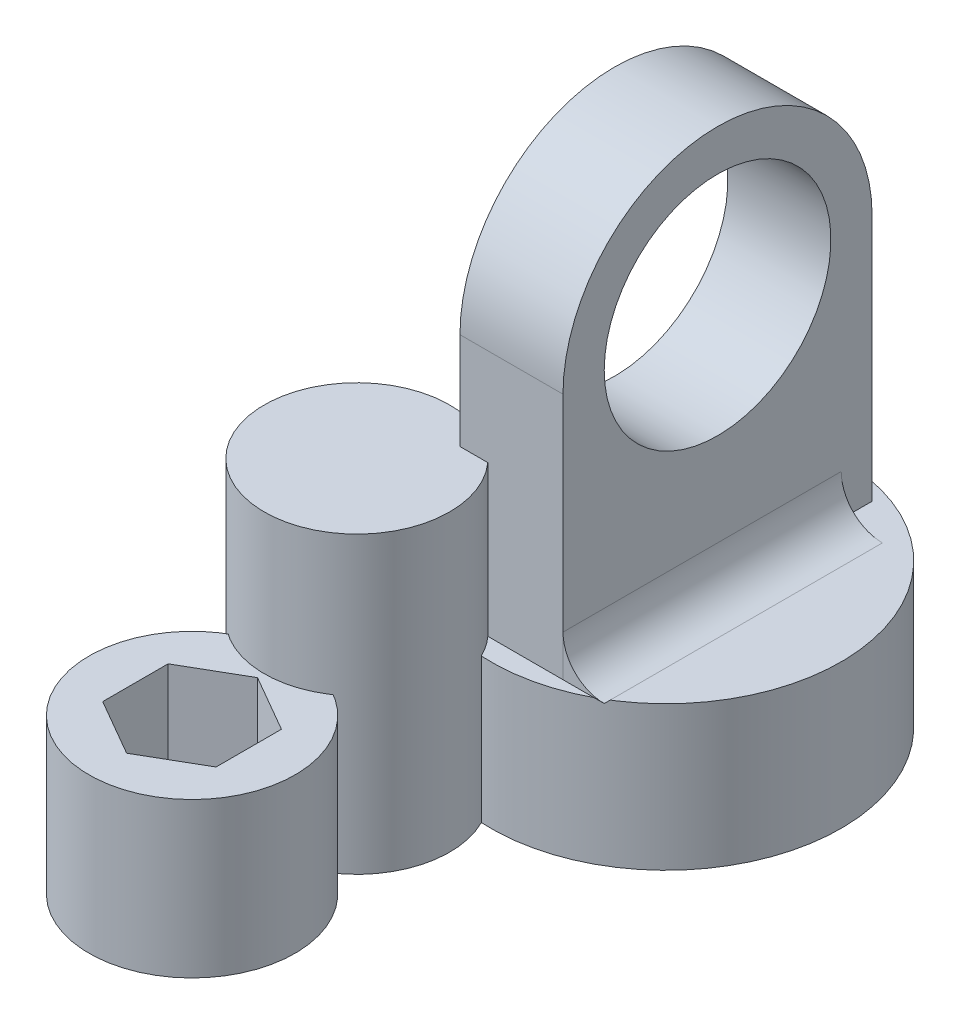
ISO-10303-21;
HEADER;
FILE_DESCRIPTION(('STEP AP214'),'2;1');
FILE_NAME('part.step','',(''),(''),'','','');
FILE_SCHEMA(('AUTOMOTIVE_DESIGN { 1 0 10303 214 1 1 1 1 }'));
ENDSEC;
DATA;
#1=APPLICATION_CONTEXT('core data for automotive mechanical design processes');
#2=APPLICATION_PROTOCOL_DEFINITION('international standard','automotive_design',2000,#1);
#3=PRODUCT_CONTEXT('',#1,'mechanical');
#4=PRODUCT('Part','Part','',(#3));
#5=PRODUCT_RELATED_PRODUCT_CATEGORY('part','',(#4));
#6=PRODUCT_DEFINITION_FORMATION('','',#4);
#7=PRODUCT_DEFINITION_CONTEXT('part definition',#1,'design');
#8=PRODUCT_DEFINITION('design','',#6,#7);
#9=PRODUCT_DEFINITION_SHAPE('','',#8);
#10=(LENGTH_UNIT() NAMED_UNIT(*) SI_UNIT(.MILLI.,.METRE.));
#11=(NAMED_UNIT(*) PLANE_ANGLE_UNIT() SI_UNIT($,.RADIAN.));
#12=(NAMED_UNIT(*) SI_UNIT($,.STERADIAN.) SOLID_ANGLE_UNIT());
#13=UNCERTAINTY_MEASURE_WITH_UNIT(LENGTH_MEASURE(1.E-05),#10,'distance_accuracy_value','');
#14=(GEOMETRIC_REPRESENTATION_CONTEXT(3) GLOBAL_UNCERTAINTY_ASSIGNED_CONTEXT((#13)) GLOBAL_UNIT_ASSIGNED_CONTEXT((#10,
#11,#12)) REPRESENTATION_CONTEXT('',''));
#15=CARTESIAN_POINT('',(0.,0.,0.));
#16=DIRECTION('',(0.,0.,1.));
#17=DIRECTION('',(1.,0.,0.));
#18=AXIS2_PLACEMENT_3D('',#15,#16,#17);
#19=CARTESIAN_POINT('',(-4.4999999999995,7.5,18.5));
#20=DIRECTION('',(0.,-1.,0.));
#21=DIRECTION('',(0.,0.,-1.));
#22=AXIS2_PLACEMENT_3D('',#19,#20,#21);
#23=CYLINDRICAL_SURFACE('',#22,4.99999999999976);
#24=CARTESIAN_POINT('',(-4.4999999999995,7.5,18.5));
#25=DIRECTION('',(0.,-1.,0.));
#26=DIRECTION('',(0.,0.,-1.));
#27=AXIS2_PLACEMENT_3D('',#24,#25,#26);
#28=CIRCLE('',#27,4.99999999999976);
#29=CARTESIAN_POINT('',(-4.4999999999995,7.5,13.5000000000002));
#30=VERTEX_POINT('',#29);
#31=EDGE_CURVE('E12',#30,#30,#28,.T.);
#32=ORIENTED_EDGE('',*,*,#31,.T.);
#33=EDGE_LOOP('',(#32));
#34=FACE_BOUND('',#33,.T.);
#35=CARTESIAN_POINT('',(-4.4999999999995,0.,18.5));
#36=DIRECTION('',(0.,-1.,0.));
#37=DIRECTION('',(0.,0.,-1.));
#38=AXIS2_PLACEMENT_3D('',#35,#36,#37);
#39=CIRCLE('',#38,4.99999999999976);
#40=CARTESIAN_POINT('',(-4.4999999999995,0.,13.5000000000002));
#41=VERTEX_POINT('',#40);
#42=EDGE_CURVE('E49',#41,#41,#39,.T.);
#43=ORIENTED_EDGE('',*,*,#42,.F.);
#44=EDGE_LOOP('',(#43));
#45=FACE_BOUND('',#44,.T.);
#46=ADVANCED_FACE('F46',(#34,#45),#23,.T.);
#47=CARTESIAN_POINT('',(-4.4999999999995,7.5,18.5));
#48=DIRECTION('',(0.,-1.,0.));
#49=DIRECTION('',(0.,0.,-1.));
#50=AXIS2_PLACEMENT_3D('',#47,#48,#49);
#51=PLANE('',#50);
#52=DIRECTION('',(-0.866025403784439,0.,-0.5));
#53=VECTOR('',#52,1.);
#54=CARTESIAN_POINT('',(-4.4999999999995,7.5,21.6754264805429));
#55=LINE('',#54,#53);
#56=CARTESIAN_POINT('',(-4.4999999999995,7.5,21.6754264805429));
#57=VERTEX_POINT('',#56);
#58=CARTESIAN_POINT('',(-7.24999999999949,7.5,20.0877132402714));
#59=VERTEX_POINT('',#58);
#60=EDGE_CURVE('E106',#57,#59,#55,.T.);
#61=ORIENTED_EDGE('',*,*,#60,.T.);
#62=DIRECTION('',(0.,0.,-1.));
#63=VECTOR('',#62,1.);
#64=CARTESIAN_POINT('',(-7.24999999999949,7.5,20.0877132402714));
#65=LINE('',#64,#63);
#66=CARTESIAN_POINT('',(-7.24999999999949,7.5,16.9122867597285));
#67=VERTEX_POINT('',#66);
#68=EDGE_CURVE('E100',#59,#67,#65,.T.);
#69=ORIENTED_EDGE('',*,*,#68,.T.);
#70=DIRECTION('',(0.866025403784438,0.,-0.5));
#71=VECTOR('',#70,1.);
#72=CARTESIAN_POINT('',(-7.24999999999949,7.5,16.9122867597285));
#73=LINE('',#72,#71);
#74=CARTESIAN_POINT('',(-4.4999999999995,7.5,15.324573519457));
#75=VERTEX_POINT('',#74);
#76=EDGE_CURVE('E109',#67,#75,#73,.T.);
#77=ORIENTED_EDGE('',*,*,#76,.T.);
#78=DIRECTION('',(0.866025403784439,0.,0.5));
#79=VECTOR('',#78,1.);
#80=CARTESIAN_POINT('',(-4.4999999999995,7.5,15.324573519457));
#81=LINE('',#80,#79);
#82=CARTESIAN_POINT('',(-1.7499999999995,7.5,16.9122867597285));
#83=VERTEX_POINT('',#82);
#84=EDGE_CURVE('E60',#75,#83,#81,.T.);
#85=ORIENTED_EDGE('',*,*,#84,.T.);
#86=DIRECTION('',(0.,0.,1.));
#87=VECTOR('',#86,1.);
#88=CARTESIAN_POINT('',(-1.7499999999995,7.5,16.9122867597285));
#89=LINE('',#88,#87);
#90=CARTESIAN_POINT('',(-1.7499999999995,7.5,20.0877132402714));
#91=VERTEX_POINT('',#90);
#92=EDGE_CURVE('E124',#83,#91,#89,.T.);
#93=ORIENTED_EDGE('',*,*,#92,.T.);
#94=DIRECTION('',(-0.866025403784439,0.,0.5));
#95=VECTOR('',#94,1.);
#96=CARTESIAN_POINT('',(-1.7499999999995,7.5,20.0877132402714));
#97=LINE('',#96,#95);
#98=EDGE_CURVE('E127',#91,#57,#97,.T.);
#99=ORIENTED_EDGE('',*,*,#98,.T.);
#100=EDGE_LOOP('',(#61,#69,#77,#85,#93,#99));
#101=FACE_BOUND('',#100,.T.);
#102=ORIENTED_EDGE('',*,*,#31,.F.);
#103=EDGE_LOOP('',(#102));
#104=FACE_BOUND('',#103,.T.);
#105=ADVANCED_FACE('F113',(#101,#104),#51,.F.);
#106=CARTESIAN_POINT('',(-4.4999999999995,0.,18.5));
#107=DIRECTION('',(0.,-1.,0.));
#108=DIRECTION('',(0.,0.,-1.));
#109=AXIS2_PLACEMENT_3D('',#106,#107,#108);
#110=PLANE('',#109);
#111=DIRECTION('',(0.,0.,-1.));
#112=VECTOR('',#111,1.);
#113=CARTESIAN_POINT('',(-7.24999999999949,0.,20.0877132402714));
#114=LINE('',#113,#112);
#115=CARTESIAN_POINT('',(-7.24999999999949,0.,20.0877132402714));
#116=VERTEX_POINT('',#115);
#117=CARTESIAN_POINT('',(-7.24999999999949,0.,16.9122867597285));
#118=VERTEX_POINT('',#117);
#119=EDGE_CURVE('E68',#116,#118,#114,.T.);
#120=ORIENTED_EDGE('',*,*,#119,.F.);
#121=DIRECTION('',(-0.866025403784439,0.,-0.5));
#122=VECTOR('',#121,1.);
#123=CARTESIAN_POINT('',(-4.4999999999995,0.,21.6754264805429));
#124=LINE('',#123,#122);
#125=CARTESIAN_POINT('',(-4.4999999999995,0.,21.6754264805429));
#126=VERTEX_POINT('',#125);
#127=EDGE_CURVE('E117',#126,#116,#124,.T.);
#128=ORIENTED_EDGE('',*,*,#127,.F.);
#129=DIRECTION('',(-0.866025403784439,0.,0.5));
#130=VECTOR('',#129,1.);
#131=CARTESIAN_POINT('',(-1.7499999999995,0.,20.0877132402714));
#132=LINE('',#131,#130);
#133=CARTESIAN_POINT('',(-1.7499999999995,0.,20.0877132402714));
#134=VERTEX_POINT('',#133);
#135=EDGE_CURVE('E120',#134,#126,#132,.T.);
#136=ORIENTED_EDGE('',*,*,#135,.F.);
#137=DIRECTION('',(0.,0.,1.));
#138=VECTOR('',#137,1.);
#139=CARTESIAN_POINT('',(-1.7499999999995,0.,16.9122867597285));
#140=LINE('',#139,#138);
#141=CARTESIAN_POINT('',(-1.7499999999995,0.,16.9122867597285));
#142=VERTEX_POINT('',#141);
#143=EDGE_CURVE('E136',#142,#134,#140,.T.);
#144=ORIENTED_EDGE('',*,*,#143,.F.);
#145=DIRECTION('',(0.866025403784439,0.,0.5));
#146=VECTOR('',#145,1.);
#147=CARTESIAN_POINT('',(-4.4999999999995,0.,15.324573519457));
#148=LINE('',#147,#146);
#149=CARTESIAN_POINT('',(-4.4999999999995,0.,15.324573519457));
#150=VERTEX_POINT('',#149);
#151=EDGE_CURVE('E133',#150,#142,#148,.T.);
#152=ORIENTED_EDGE('',*,*,#151,.F.);
#153=DIRECTION('',(0.866025403784438,0.,-0.5));
#154=VECTOR('',#153,1.);
#155=CARTESIAN_POINT('',(-7.24999999999949,0.,16.9122867597285));
#156=LINE('',#155,#154);
#157=EDGE_CURVE('E131',#118,#150,#156,.T.);
#158=ORIENTED_EDGE('',*,*,#157,.F.);
#159=EDGE_LOOP('',(#120,#128,#136,#144,#152,#158));
#160=FACE_BOUND('',#159,.T.);
#161=ORIENTED_EDGE('',*,*,#42,.T.);
#162=EDGE_LOOP('',(#161));
#163=FACE_BOUND('',#162,.T.);
#164=ADVANCED_FACE('F153',(#160,#163),#110,.T.);
#165=CARTESIAN_POINT('',(-7.24999999999949,7.5,20.0877132402714));
#166=DIRECTION('',(-1.,0.,0.));
#167=DIRECTION('',(0.,0.,1.));
#168=AXIS2_PLACEMENT_3D('',#165,#166,#167);
#169=PLANE('',#168);
#170=ORIENTED_EDGE('',*,*,#119,.T.);
#171=DIRECTION('',(0.,-1.,0.));
#172=VECTOR('',#171,1.);
#173=CARTESIAN_POINT('',(-7.24999999999949,7.5,16.9122867597285));
#174=LINE('',#173,#172);
#175=EDGE_CURVE('E96',#67,#118,#174,.T.);
#176=ORIENTED_EDGE('',*,*,#175,.F.);
#177=ORIENTED_EDGE('',*,*,#68,.F.);
#178=DIRECTION('',(0.,-1.,0.));
#179=VECTOR('',#178,1.);
#180=CARTESIAN_POINT('',(-7.24999999999949,7.5,20.0877132402714));
#181=LINE('',#180,#179);
#182=EDGE_CURVE('E141',#59,#116,#181,.T.);
#183=ORIENTED_EDGE('',*,*,#182,.T.);
#184=EDGE_LOOP('',(#170,#176,#177,#183));
#185=FACE_BOUND('',#184,.T.);
#186=ADVANCED_FACE('F98',(#185),#169,.F.);
#187=CARTESIAN_POINT('',(-4.4999999999995,7.5,21.6754264805429));
#188=DIRECTION('',(-0.5,0.,0.866025403784439));
#189=DIRECTION('',(0.866025403784439,0.,0.5));
#190=AXIS2_PLACEMENT_3D('',#187,#188,#189);
#191=PLANE('',#190);
#192=ORIENTED_EDGE('',*,*,#127,.T.);
#193=ORIENTED_EDGE('',*,*,#182,.F.);
#194=ORIENTED_EDGE('',*,*,#60,.F.);
#195=DIRECTION('',(0.,-1.,0.));
#196=VECTOR('',#195,1.);
#197=CARTESIAN_POINT('',(-4.4999999999995,7.5,21.6754264805429));
#198=LINE('',#197,#196);
#199=EDGE_CURVE('E143',#57,#126,#198,.T.);
#200=ORIENTED_EDGE('',*,*,#199,.T.);
#201=EDGE_LOOP('',(#192,#193,#194,#200));
#202=FACE_BOUND('',#201,.T.);
#203=ADVANCED_FACE('F164',(#202),#191,.F.);
#204=CARTESIAN_POINT('',(-1.7499999999995,7.5,20.0877132402714));
#205=DIRECTION('',(0.5,0.,0.866025403784438));
#206=DIRECTION('',(0.866025403784439,0.,-0.5));
#207=AXIS2_PLACEMENT_3D('',#204,#205,#206);
#208=PLANE('',#207);
#209=ORIENTED_EDGE('',*,*,#135,.T.);
#210=ORIENTED_EDGE('',*,*,#199,.F.);
#211=ORIENTED_EDGE('',*,*,#98,.F.);
#212=DIRECTION('',(0.,-1.,0.));
#213=VECTOR('',#212,1.);
#214=CARTESIAN_POINT('',(-1.7499999999995,7.5,20.0877132402714));
#215=LINE('',#214,#213);
#216=EDGE_CURVE('E145',#91,#134,#215,.T.);
#217=ORIENTED_EDGE('',*,*,#216,.T.);
#218=EDGE_LOOP('',(#209,#210,#211,#217));
#219=FACE_BOUND('',#218,.T.);
#220=ADVANCED_FACE('F162',(#219),#208,.F.);
#221=CARTESIAN_POINT('',(-1.7499999999995,7.5,16.9122867597285));
#222=DIRECTION('',(1.,0.,0.));
#223=DIRECTION('',(0.,0.,-1.));
#224=AXIS2_PLACEMENT_3D('',#221,#222,#223);
#225=PLANE('',#224);
#226=ORIENTED_EDGE('',*,*,#143,.T.);
#227=ORIENTED_EDGE('',*,*,#216,.F.);
#228=ORIENTED_EDGE('',*,*,#92,.F.);
#229=DIRECTION('',(0.,-1.,0.));
#230=VECTOR('',#229,1.);
#231=CARTESIAN_POINT('',(-1.7499999999995,7.5,16.9122867597285));
#232=LINE('',#231,#230);
#233=EDGE_CURVE('E147',#83,#142,#232,.T.);
#234=ORIENTED_EDGE('',*,*,#233,.T.);
#235=EDGE_LOOP('',(#226,#227,#228,#234));
#236=FACE_BOUND('',#235,.T.);
#237=ADVANCED_FACE('F158',(#236),#225,.F.);
#238=CARTESIAN_POINT('',(-4.4999999999995,7.5,15.324573519457));
#239=DIRECTION('',(0.5,0.,-0.866025403784439));
#240=DIRECTION('',(-0.866025403784439,0.,-0.5));
#241=AXIS2_PLACEMENT_3D('',#238,#239,#240);
#242=PLANE('',#241);
#243=ORIENTED_EDGE('',*,*,#151,.T.);
#244=ORIENTED_EDGE('',*,*,#233,.F.);
#245=ORIENTED_EDGE('',*,*,#84,.F.);
#246=DIRECTION('',(0.,-1.,0.));
#247=VECTOR('',#246,1.);
#248=CARTESIAN_POINT('',(-4.4999999999995,7.5,15.324573519457));
#249=LINE('',#248,#247);
#250=EDGE_CURVE('E105',#75,#150,#249,.T.);
#251=ORIENTED_EDGE('',*,*,#250,.T.);
#252=EDGE_LOOP('',(#243,#244,#245,#251));
#253=FACE_BOUND('',#252,.T.);
#254=ADVANCED_FACE('F149',(#253),#242,.F.);
#255=CARTESIAN_POINT('',(-7.24999999999949,7.5,16.9122867597285));
#256=DIRECTION('',(-0.5,0.,-0.866025403784438));
#257=DIRECTION('',(-0.866025403784439,0.,0.5));
#258=AXIS2_PLACEMENT_3D('',#255,#256,#257);
#259=PLANE('',#258);
#260=ORIENTED_EDGE('',*,*,#157,.T.);
#261=ORIENTED_EDGE('',*,*,#250,.F.);
#262=ORIENTED_EDGE('',*,*,#76,.F.);
#263=ORIENTED_EDGE('',*,*,#175,.T.);
#264=EDGE_LOOP('',(#260,#261,#262,#263));
#265=FACE_BOUND('',#264,.T.);
#266=ADVANCED_FACE('F110',(#265),#259,.F.);
#267=CLOSED_SHELL('',(#46,#105,#164,#186,#203,#220,#237,#254,#266));
#268=MANIFOLD_SOLID_BREP('B2',#267);
#269=CARTESIAN_POINT('',(4.50000000000002,9.00000000000005,7.49999999999903));
#270=DIRECTION('',(0.,0.,-1.));
#271=DIRECTION('',(-1.,0.,0.));
#272=AXIS2_PLACEMENT_3D('',#269,#270,#271);
#273=CYLINDRICAL_SURFACE('',#272,1.99999999999905);
#274=CARTESIAN_POINT('',(4.49999999999966,8.99999999999996,-6.00000000000097));
#275=DIRECTION('',(0.,0.,-1.));
#276=DIRECTION('',(-1.,0.,0.));
#277=AXIS2_PLACEMENT_3D('',#274,#275,#276);
#278=CIRCLE('',#277,1.99999999999905);
#279=CARTESIAN_POINT('',(4.49999999999966,6.99999999999996,-6.00000000000096));
#280=VERTEX_POINT('',#279);
#281=CARTESIAN_POINT('',(2.49999999999972,8.99999999999996,-6.00000000000092));
#282=VERTEX_POINT('',#281);
#283=EDGE_CURVE('E306',#280,#282,#278,.T.);
#284=ORIENTED_EDGE('',*,*,#283,.T.);
#285=DIRECTION('',(0.,0.,-1.));
#286=VECTOR('',#285,1.);
#287=CARTESIAN_POINT('',(2.50000000000008,9.00000000000005,7.49999999999908));
#288=LINE('',#287,#286);
#289=CARTESIAN_POINT('',(2.50000000000008,9.00000000000005,7.49999999999908));
#290=VERTEX_POINT('',#289);
#291=EDGE_CURVE('E44',#290,#282,#288,.T.);
#292=ORIENTED_EDGE('',*,*,#291,.F.);
#293=CARTESIAN_POINT('',(4.50000000000002,9.00000000000005,7.49999999999903));
#294=DIRECTION('',(0.,0.,-1.));
#295=DIRECTION('',(-1.,0.,0.));
#296=AXIS2_PLACEMENT_3D('',#293,#294,#295);
#297=CIRCLE('',#296,1.99999999999905);
#298=CARTESIAN_POINT('',(4.50000000000002,7.00000000000005,7.49999999999904));
#299=VERTEX_POINT('',#298);
#300=EDGE_CURVE('E293',#299,#290,#297,.T.);
#301=ORIENTED_EDGE('',*,*,#300,.F.);
#302=DIRECTION('',(0.,0.,-1.));
#303=VECTOR('',#302,1.);
#304=CARTESIAN_POINT('',(4.50000000000002,7.00000000000005,7.49999999999904));
#305=LINE('',#304,#303);
#306=EDGE_CURVE('E256',#299,#280,#305,.T.);
#307=ORIENTED_EDGE('',*,*,#306,.T.);
#308=EDGE_LOOP('',(#284,#292,#301,#307));
#309=FACE_BOUND('',#308,.T.);
#310=ADVANCED_FACE('F253',(#309),#273,.F.);
#311=CARTESIAN_POINT('',(2.50000000000008,0.,7.49999999999914));
#312=DIRECTION('',(1.,0.,0.));
#313=DIRECTION('',(0.,0.,-1.));
#314=AXIS2_PLACEMENT_3D('',#311,#312,#313);
#315=PLANE('',#314);
#316=DIRECTION('',(0.,-1.,0.));
#317=VECTOR('',#316,1.);
#318=CARTESIAN_POINT('',(2.49999999999972,0.,-6.00000000000086));
#319=LINE('',#318,#317);
#320=CARTESIAN_POINT('',(2.49999999999972,7.0000000000012,-6.0000000000009));
#321=VERTEX_POINT('',#320);
#322=EDGE_CURVE('E281',#282,#321,#319,.T.);
#323=ORIENTED_EDGE('',*,*,#322,.T.);
#324=DIRECTION('',(0.,0.,-1.));
#325=VECTOR('',#324,1.);
#326=CARTESIAN_POINT('',(2.50000000000008,7.00000000000129,7.4999999999991));
#327=LINE('',#326,#325);
#328=CARTESIAN_POINT('',(2.50000000000008,7.00000000000129,7.4999999999991));
#329=VERTEX_POINT('',#328);
#330=EDGE_CURVE('E262',#329,#321,#327,.T.);
#331=ORIENTED_EDGE('',*,*,#330,.F.);
#332=DIRECTION('',(0.,-1.,0.));
#333=VECTOR('',#332,1.);
#334=CARTESIAN_POINT('',(2.50000000000008,0.,7.49999999999914));
#335=LINE('',#334,#333);
#336=EDGE_CURVE('E270',#290,#329,#335,.T.);
#337=ORIENTED_EDGE('',*,*,#336,.F.);
#338=ORIENTED_EDGE('',*,*,#291,.T.);
#339=EDGE_LOOP('',(#323,#331,#337,#338));
#340=FACE_BOUND('',#339,.T.);
#341=ADVANCED_FACE('F317',(#340),#315,.F.);
#342=CARTESIAN_POINT('',(4.52555765011249E-12,7.00000000000283,7.49999999999916));
#343=DIRECTION('',(6.17995238316755E-13,1.,0.));
#344=DIRECTION('',(-1.,6.17995238316755E-13,0.));
#345=AXIS2_PLACEMENT_3D('',#342,#343,#344);
#346=PLANE('',#345);
#347=DIRECTION('',(1.,-6.17995238316756E-13,0.));
#348=VECTOR('',#347,1.);
#349=CARTESIAN_POINT('',(4.16659479067556E-12,7.00000000000274,-6.00000000000084));
#350=LINE('',#349,#348);
#351=EDGE_CURVE('E299',#321,#280,#350,.T.);
#352=ORIENTED_EDGE('',*,*,#351,.T.);
#353=ORIENTED_EDGE('',*,*,#306,.F.);
#354=DIRECTION('',(1.,-6.17995238316756E-13,0.));
#355=VECTOR('',#354,1.);
#356=CARTESIAN_POINT('',(4.52555765011249E-12,7.00000000000283,7.49999999999916));
#357=LINE('',#356,#355);
#358=EDGE_CURVE('E289',#329,#299,#357,.T.);
#359=ORIENTED_EDGE('',*,*,#358,.F.);
#360=ORIENTED_EDGE('',*,*,#330,.T.);
#361=EDGE_LOOP('',(#352,#353,#359,#360));
#362=FACE_BOUND('',#361,.T.);
#363=ADVANCED_FACE('F298',(#362),#346,.F.);
#364=CARTESIAN_POINT('',(1.99590981893486E-13,0.,7.49999999999921));
#365=DIRECTION('',(0.,0.,-1.));
#366=DIRECTION('',(-1.,0.,0.));
#367=AXIS2_PLACEMENT_3D('',#364,#365,#366);
#368=PLANE('',#367);
#369=ORIENTED_EDGE('',*,*,#300,.T.);
#370=ORIENTED_EDGE('',*,*,#336,.T.);
#371=ORIENTED_EDGE('',*,*,#358,.T.);
#372=EDGE_LOOP('',(#369,#370,#371));
#373=FACE_BOUND('',#372,.T.);
#374=ADVANCED_FACE('F291',(#373),#368,.F.);
#375=CARTESIAN_POINT('',(-1.59371877543443E-13,0.,-6.00000000000079));
#376=DIRECTION('',(0.,0.,-1.));
#377=DIRECTION('',(-1.,0.,0.));
#378=AXIS2_PLACEMENT_3D('',#375,#376,#377);
#379=PLANE('',#378);
#380=ORIENTED_EDGE('',*,*,#283,.F.);
#381=ORIENTED_EDGE('',*,*,#351,.F.);
#382=ORIENTED_EDGE('',*,*,#322,.F.);
#383=EDGE_LOOP('',(#380,#381,#382));
#384=FACE_BOUND('',#383,.T.);
#385=ADVANCED_FACE('F308',(#384),#379,.T.);
#386=CLOSED_SHELL('',(#310,#341,#363,#374,#385));
#387=MANIFOLD_SOLID_BREP('B6',#386);
#388=CARTESIAN_POINT('',(-4.49999999999998,9.00000000000005,7.49999999999927));
#389=DIRECTION('',(0.,0.,-1.));
#390=DIRECTION('',(-1.,0.,0.));
#391=AXIS2_PLACEMENT_3D('',#388,#389,#390);
#392=CYLINDRICAL_SURFACE('',#391,1.99999999999905);
#393=CARTESIAN_POINT('',(-4.50000000000034,8.99999999999996,-6.00000000000073));
#394=DIRECTION('',(0.,0.,-1.));
#395=DIRECTION('',(-1.,0.,0.));
#396=AXIS2_PLACEMENT_3D('',#393,#394,#395);
#397=CIRCLE('',#396,1.99999999999905);
#398=CARTESIAN_POINT('',(-2.50000000000028,8.99999999999996,-6.00000000000078));
#399=VERTEX_POINT('',#398);
#400=CARTESIAN_POINT('',(-4.50000000000034,6.99999999999996,-6.00000000000072));
#401=VERTEX_POINT('',#400);
#402=EDGE_CURVE('E416',#399,#401,#397,.T.);
#403=ORIENTED_EDGE('',*,*,#402,.T.);
#404=DIRECTION('',(0.,0.,-1.));
#405=VECTOR('',#404,1.);
#406=CARTESIAN_POINT('',(-4.49999999999998,7.00000000000005,7.49999999999928));
#407=LINE('',#406,#405);
#408=CARTESIAN_POINT('',(-4.49999999999998,7.00000000000005,7.49999999999928));
#409=VERTEX_POINT('',#408);
#410=EDGE_CURVE('E251',#409,#401,#407,.T.);
#411=ORIENTED_EDGE('',*,*,#410,.F.);
#412=CARTESIAN_POINT('',(-4.49999999999998,9.00000000000005,7.49999999999927));
#413=DIRECTION('',(0.,0.,-1.));
#414=DIRECTION('',(-1.,0.,0.));
#415=AXIS2_PLACEMENT_3D('',#412,#413,#414);
#416=CIRCLE('',#415,1.99999999999905);
#417=CARTESIAN_POINT('',(-2.49999999999992,9.00000000000005,7.49999999999922));
#418=VERTEX_POINT('',#417);
#419=EDGE_CURVE('E403',#418,#409,#416,.T.);
#420=ORIENTED_EDGE('',*,*,#419,.F.);
#421=DIRECTION('',(0.,0.,-1.));
#422=VECTOR('',#421,1.);
#423=CARTESIAN_POINT('',(-2.49999999999992,9.00000000000005,7.49999999999922));
#424=LINE('',#423,#422);
#425=EDGE_CURVE('E366',#418,#399,#424,.T.);
#426=ORIENTED_EDGE('',*,*,#425,.T.);
#427=EDGE_LOOP('',(#403,#411,#420,#426));
#428=FACE_BOUND('',#427,.T.);
#429=ADVANCED_FACE('F363',(#428),#392,.F.);
#430=CARTESIAN_POINT('',(-4.12941145240823E-12,7.00000000000283,7.49999999999916));
#431=DIRECTION('',(-6.18428919185714E-13,1.,0.));
#432=DIRECTION('',(-1.,-6.18428919185714E-13,0.));
#433=AXIS2_PLACEMENT_3D('',#430,#431,#432);
#434=PLANE('',#433);
#435=DIRECTION('',(1.,6.18428919185713E-13,0.));
#436=VECTOR('',#435,1.);
#437=CARTESIAN_POINT('',(-4.48837431184516E-12,7.00000000000274,-6.00000000000084));
#438=LINE('',#437,#436);
#439=CARTESIAN_POINT('',(-2.50000000000028,7.0000000000012,-6.00000000000077));
#440=VERTEX_POINT('',#439);
#441=EDGE_CURVE('E391',#401,#440,#438,.T.);
#442=ORIENTED_EDGE('',*,*,#441,.T.);
#443=DIRECTION('',(0.,0.,-1.));
#444=VECTOR('',#443,1.);
#445=CARTESIAN_POINT('',(-2.49999999999992,7.00000000000129,7.49999999999923));
#446=LINE('',#445,#444);
#447=CARTESIAN_POINT('',(-2.49999999999992,7.00000000000129,7.49999999999923));
#448=VERTEX_POINT('',#447);
#449=EDGE_CURVE('E372',#448,#440,#446,.T.);
#450=ORIENTED_EDGE('',*,*,#449,.F.);
#451=DIRECTION('',(1.,6.18428919185713E-13,0.));
#452=VECTOR('',#451,1.);
#453=CARTESIAN_POINT('',(-4.12941145240823E-12,7.00000000000283,7.49999999999916));
#454=LINE('',#453,#452);
#455=EDGE_CURVE('E380',#409,#448,#454,.T.);
#456=ORIENTED_EDGE('',*,*,#455,.F.);
#457=ORIENTED_EDGE('',*,*,#410,.T.);
#458=EDGE_LOOP('',(#442,#450,#456,#457));
#459=FACE_BOUND('',#458,.T.);
#460=ADVANCED_FACE('F427',(#459),#434,.F.);
#461=CARTESIAN_POINT('',(-2.49999999999992,0.,7.49999999999928));
#462=DIRECTION('',(-1.,0.,0.));
#463=DIRECTION('',(0.,0.,1.));
#464=AXIS2_PLACEMENT_3D('',#461,#462,#463);
#465=PLANE('',#464);
#466=DIRECTION('',(0.,1.,0.));
#467=VECTOR('',#466,1.);
#468=CARTESIAN_POINT('',(-2.50000000000028,0.,-6.00000000000072));
#469=LINE('',#468,#467);
#470=EDGE_CURVE('E409',#440,#399,#469,.T.);
#471=ORIENTED_EDGE('',*,*,#470,.T.);
#472=ORIENTED_EDGE('',*,*,#425,.F.);
#473=DIRECTION('',(0.,1.,0.));
#474=VECTOR('',#473,1.);
#475=CARTESIAN_POINT('',(-2.49999999999992,0.,7.49999999999928));
#476=LINE('',#475,#474);
#477=EDGE_CURVE('E399',#448,#418,#476,.T.);
#478=ORIENTED_EDGE('',*,*,#477,.F.);
#479=ORIENTED_EDGE('',*,*,#449,.T.);
#480=EDGE_LOOP('',(#471,#472,#478,#479));
#481=FACE_BOUND('',#480,.T.);
#482=ADVANCED_FACE('F408',(#481),#465,.F.);
#483=CARTESIAN_POINT('',(1.99590981893486E-13,0.,7.49999999999921));
#484=DIRECTION('',(0.,0.,-1.));
#485=DIRECTION('',(-1.,0.,0.));
#486=AXIS2_PLACEMENT_3D('',#483,#484,#485);
#487=PLANE('',#486);
#488=ORIENTED_EDGE('',*,*,#419,.T.);
#489=ORIENTED_EDGE('',*,*,#455,.T.);
#490=ORIENTED_EDGE('',*,*,#477,.T.);
#491=EDGE_LOOP('',(#488,#489,#490));
#492=FACE_BOUND('',#491,.T.);
#493=ADVANCED_FACE('F401',(#492),#487,.F.);
#494=CARTESIAN_POINT('',(-1.59371877543443E-13,0.,-6.00000000000079));
#495=DIRECTION('',(0.,0.,-1.));
#496=DIRECTION('',(-1.,0.,0.));
#497=AXIS2_PLACEMENT_3D('',#494,#495,#496);
#498=PLANE('',#497);
#499=ORIENTED_EDGE('',*,*,#402,.F.);
#500=ORIENTED_EDGE('',*,*,#470,.F.);
#501=ORIENTED_EDGE('',*,*,#441,.F.);
#502=EDGE_LOOP('',(#499,#500,#501));
#503=FACE_BOUND('',#502,.T.);
#504=ADVANCED_FACE('F418',(#503),#498,.T.);
#505=CLOSED_SHELL('',(#429,#460,#482,#493,#504));
#506=MANIFOLD_SOLID_BREP('B38',#505);
#507=CARTESIAN_POINT('',(-4.4999999999995,25.0279220613613,10.5));
#508=DIRECTION('',(0.,-1.,0.));
#509=DIRECTION('',(0.,0.,-1.));
#510=AXIS2_PLACEMENT_3D('',#507,#508,#509);
#511=CYLINDRICAL_SURFACE('',#510,4.49999999999976);
#512=DIRECTION('',(0.,-1.,0.));
#513=VECTOR('',#512,1.);
#514=CARTESIAN_POINT('',(-1.14589803375095,25.0279220613613,7.49999999999907));
#515=LINE('',#514,#513);
#516=CARTESIAN_POINT('',(-1.14589803375151,14.3000000000041,7.49999999999915));
#517=VERTEX_POINT('',#516);
#518=CARTESIAN_POINT('',(-1.14589803375084,7.0000000000013,7.49999999999919));
#519=VERTEX_POINT('',#518);
#520=EDGE_CURVE('E575',#517,#519,#515,.T.);
#521=ORIENTED_EDGE('',*,*,#520,.F.);
#522=CARTESIAN_POINT('',(-4.4999999999995,14.3000000000041,10.5));
#523=DIRECTION('',(0.,1.,0.));
#524=DIRECTION('',(0.,0.,1.));
#525=AXIS2_PLACEMENT_3D('',#522,#523,#524);
#526=CIRCLE('',#525,4.49999999999929);
#527=CARTESIAN_POINT('',(-2.49999999999995,14.3000000000041,6.46887112585127));
#528=VERTEX_POINT('',#527);
#529=EDGE_CURVE('E583',#528,#517,#526,.T.);
#530=ORIENTED_EDGE('',*,*,#529,.F.);
#531=DIRECTION('',(0.,-1.,0.));
#532=VECTOR('',#531,1.);
#533=CARTESIAN_POINT('',(-2.49999999999995,25.0279220613613,6.46887112585075));
#534=LINE('',#533,#532);
#535=CARTESIAN_POINT('',(-2.49999999999995,7.00000000000129,6.46887112585075));
#536=VERTEX_POINT('',#535);
#537=EDGE_CURVE('E571',#536,#528,#534,.F.);
#538=ORIENTED_EDGE('',*,*,#537,.F.);
#539=CARTESIAN_POINT('',(-4.4999999999995,7.,10.5));
#540=DIRECTION('',(0.,1.,0.));
#541=DIRECTION('',(0.,0.,1.));
#542=AXIS2_PLACEMENT_3D('',#539,#540,#541);
#543=CIRCLE('',#542,4.49999999999976);
#544=CARTESIAN_POINT('',(-5.81760099881811,7.,6.1972186195543));
#545=VERTEX_POINT('',#544);
#546=EDGE_CURVE('E605',#545,#536,#543,.F.);
#547=ORIENTED_EDGE('',*,*,#546,.F.);
#548=DIRECTION('',(0.,-1.,0.));
#549=VECTOR('',#548,1.);
#550=CARTESIAN_POINT('',(-5.81760099881811,2.50000000000001,6.1972186195543));
#551=LINE('',#550,#549);
#552=CARTESIAN_POINT('',(-5.81760099881811,0.,6.1972186195543));
#553=VERTEX_POINT('',#552);
#554=EDGE_CURVE('E487',#553,#545,#551,.F.);
#555=ORIENTED_EDGE('',*,*,#554,.F.);
#556=CARTESIAN_POINT('',(-4.4999999999995,0.,10.5));
#557=DIRECTION('',(0.,-1.,0.));
#558=DIRECTION('',(0.,0.,-1.));
#559=AXIS2_PLACEMENT_3D('',#556,#557,#558);
#560=CIRCLE('',#559,4.49999999999976);
#561=CARTESIAN_POINT('',(-0.475502449457193,0.,8.48668942642302));
#562=VERTEX_POINT('',#561);
#563=EDGE_CURVE('E592',#562,#553,#560,.T.);
#564=ORIENTED_EDGE('',*,*,#563,.F.);
#565=DIRECTION('',(0.,-1.,0.));
#566=VECTOR('',#565,1.);
#567=CARTESIAN_POINT('',(-0.475502449457193,2.50000000000001,8.48668942642302));
#568=LINE('',#567,#566);
#569=CARTESIAN_POINT('',(-0.475502449457192,7.,8.48668942642302));
#570=VERTEX_POINT('',#569);
#571=EDGE_CURVE('E600',#570,#562,#568,.T.);
#572=ORIENTED_EDGE('',*,*,#571,.F.);
#573=EDGE_CURVE('E604',#519,#570,#543,.F.);
#574=ORIENTED_EDGE('',*,*,#573,.F.);
#575=EDGE_LOOP('',(#521,#530,#538,#547,#555,#564,#572,#574));
#576=FACE_BOUND('',#575,.T.);
#577=ADVANCED_FACE('F464',(#576),#511,.T.);
#578=CARTESIAN_POINT('',(0.,0.,0.));
#579=DIRECTION('',(0.,1.,0.));
#580=DIRECTION('',(0.,0.,1.));
#581=AXIS2_PLACEMENT_3D('',#578,#579,#580);
#582=PLANE('',#581);
#583=CARTESIAN_POINT('',(0.,0.,0.));
#584=DIRECTION('',(0.,1.,0.));
#585=DIRECTION('',(0.,0.,1.));
#586=AXIS2_PLACEMENT_3D('',#583,#584,#585);
#587=CIRCLE('',#586,8.5);
#588=EDGE_CURVE('E598',#562,#553,#587,.T.);
#589=ORIENTED_EDGE('',*,*,#588,.F.);
#590=ORIENTED_EDGE('',*,*,#563,.T.);
#591=EDGE_LOOP('',(#589,#590));
#592=FACE_BOUND('',#591,.T.);
#593=CARTESIAN_POINT('',(0.,0.,0.));
#594=DIRECTION('',(0.,1.,0.));
#595=DIRECTION('',(0.,0.,1.));
#596=AXIS2_PLACEMENT_3D('',#593,#594,#595);
#597=CIRCLE('',#596,5.5);
#598=CARTESIAN_POINT('',(0.,0.,5.5));
#599=VERTEX_POINT('',#598);
#600=EDGE_CURVE('E595',#599,#599,#597,.T.);
#601=ORIENTED_EDGE('',*,*,#600,.T.);
#602=EDGE_LOOP('',(#601));
#603=FACE_BOUND('',#602,.T.);
#604=CARTESIAN_POINT('',(-4.4999999999995,0.,10.5));
#605=DIRECTION('',(0.,-1.,0.));
#606=DIRECTION('',(0.,0.,-1.));
#607=AXIS2_PLACEMENT_3D('',#604,#605,#606);
#608=CIRCLE('',#607,1.49999999999976);
#609=CARTESIAN_POINT('',(-4.4999999999995,0.,9.00000000000022));
#610=VERTEX_POINT('',#609);
#611=EDGE_CURVE('E589',#610,#610,#608,.T.);
#612=ORIENTED_EDGE('',*,*,#611,.F.);
#613=EDGE_LOOP('',(#612));
#614=FACE_BOUND('',#613,.T.);
#615=ADVANCED_FACE('F626',(#592,#603,#614),#582,.F.);
#616=CARTESIAN_POINT('',(0.,5.,0.));
#617=DIRECTION('',(0.,-1.,0.));
#618=DIRECTION('',(0.,0.,-1.));
#619=AXIS2_PLACEMENT_3D('',#616,#617,#618);
#620=CYLINDRICAL_SURFACE('',#619,8.5);
#621=ORIENTED_EDGE('',*,*,#588,.T.);
#622=ORIENTED_EDGE('',*,*,#554,.T.);
#623=CARTESIAN_POINT('',(0.,7.,0.));
#624=DIRECTION('',(0.,1.,0.));
#625=DIRECTION('',(0.,0.,1.));
#626=AXIS2_PLACEMENT_3D('',#623,#624,#625);
#627=CIRCLE('',#626,8.5);
#628=EDGE_CURVE('E577',#570,#545,#627,.T.);
#629=ORIENTED_EDGE('',*,*,#628,.F.);
#630=ORIENTED_EDGE('',*,*,#571,.T.);
#631=EDGE_LOOP('',(#621,#622,#629,#630));
#632=FACE_BOUND('',#631,.T.);
#633=ADVANCED_FACE('F466',(#632),#620,.T.);
#634=CARTESIAN_POINT('',(0.,5.,0.));
#635=DIRECTION('',(0.,-1.,0.));
#636=DIRECTION('',(0.,0.,-1.));
#637=AXIS2_PLACEMENT_3D('',#634,#635,#636);
#638=CYLINDRICAL_SURFACE('',#637,5.5);
#639=CARTESIAN_POINT('',(0.,5.,0.));
#640=DIRECTION('',(0.,1.,0.));
#641=DIRECTION('',(0.,0.,1.));
#642=AXIS2_PLACEMENT_3D('',#639,#640,#641);
#643=CIRCLE('',#642,5.5);
#644=CARTESIAN_POINT('',(0.,5.,5.5));
#645=VERTEX_POINT('',#644);
#646=EDGE_CURVE('E580',#645,#645,#643,.T.);
#647=ORIENTED_EDGE('',*,*,#646,.T.);
#648=EDGE_LOOP('',(#647));
#649=FACE_BOUND('',#648,.T.);
#650=ORIENTED_EDGE('',*,*,#600,.F.);
#651=EDGE_LOOP('',(#650));
#652=FACE_BOUND('',#651,.T.);
#653=ADVANCED_FACE('F637',(#649,#652),#638,.F.);
#654=CARTESIAN_POINT('',(-4.4999999999995,25.0279220613613,10.5));
#655=DIRECTION('',(0.,-1.,0.));
#656=DIRECTION('',(0.,0.,-1.));
#657=AXIS2_PLACEMENT_3D('',#654,#655,#656);
#658=CYLINDRICAL_SURFACE('',#657,1.49999999999976);
#659=CARTESIAN_POINT('',(-4.4999999999995,12.3000000000041,10.5));
#660=DIRECTION('',(0.,1.,0.));
#661=DIRECTION('',(0.,0.,1.));
#662=AXIS2_PLACEMENT_3D('',#659,#660,#661);
#663=CIRCLE('',#662,1.49999999999976);
#664=CARTESIAN_POINT('',(-4.4999999999995,12.3000000000041,9.00000000000022));
#665=VERTEX_POINT('',#664);
#666=EDGE_CURVE('E586',#665,#665,#663,.F.);
#667=CARTESIAN_POINT('',(-4.4999999999995,12.3000000000041,9.00000000000022));
#668=CARTESIAN_POINT('',(-4.4999999999995,12.1718750000041,9.00000000000022));
#669=CARTESIAN_POINT('',(-4.4999999999995,12.043750000004,9.00000000000022));
#670=CARTESIAN_POINT('',(-4.4999999999995,11.7875000000039,9.00000000000022));
#671=CARTESIAN_POINT('',(-4.4999999999995,11.6593750000039,9.00000000000022));
#672=CARTESIAN_POINT('',(-4.4999999999995,11.4031250000038,9.00000000000022));
#673=CARTESIAN_POINT('',(-4.4999999999995,11.2750000000038,9.00000000000022));
#674=CARTESIAN_POINT('',(-4.4999999999995,11.0187500000037,9.00000000000022));
#675=CARTESIAN_POINT('',(-4.4999999999995,10.8906250000036,9.00000000000022));
#676=CARTESIAN_POINT('',(-4.4999999999995,10.6343750000035,9.00000000000022));
#677=CARTESIAN_POINT('',(-4.4999999999995,10.5062500000035,9.00000000000022));
#678=CARTESIAN_POINT('',(-4.4999999999995,10.2500000000034,9.00000000000022));
#679=CARTESIAN_POINT('',(-4.4999999999995,10.1218750000034,9.00000000000022));
#680=CARTESIAN_POINT('',(-4.4999999999995,9.86562500000329,9.00000000000022));
#681=CARTESIAN_POINT('',(-4.4999999999995,9.73750000000325,9.00000000000022));
#682=CARTESIAN_POINT('',(-4.4999999999995,9.48125000000317,9.00000000000022));
#683=CARTESIAN_POINT('',(-4.4999999999995,9.35312500000312,9.00000000000022));
#684=CARTESIAN_POINT('',(-4.4999999999995,9.09687500000304,9.00000000000022));
#685=CARTESIAN_POINT('',(-4.4999999999995,8.968750000003,9.00000000000022));
#686=CARTESIAN_POINT('',(-4.4999999999995,8.71250000000291,9.00000000000022));
#687=CARTESIAN_POINT('',(-4.4999999999995,8.58437500000287,9.00000000000022));
#688=CARTESIAN_POINT('',(-4.4999999999995,8.32812500000278,9.00000000000022));
#689=CARTESIAN_POINT('',(-4.4999999999995,8.20000000000274,9.00000000000022));
#690=CARTESIAN_POINT('',(-4.4999999999995,7.94375000000265,9.00000000000022));
#691=CARTESIAN_POINT('',(-4.4999999999995,7.81562500000261,9.00000000000022));
#692=CARTESIAN_POINT('',(-4.4999999999995,7.55937500000253,9.00000000000022));
#693=CARTESIAN_POINT('',(-4.4999999999995,7.43125000000248,9.00000000000022));
#694=CARTESIAN_POINT('',(-4.4999999999995,7.1750000000024,9.00000000000022));
#695=CARTESIAN_POINT('',(-4.4999999999995,7.04687500000235,9.00000000000022));
#696=CARTESIAN_POINT('',(-4.4999999999995,6.79062500000227,9.00000000000022));
#697=CARTESIAN_POINT('',(-4.4999999999995,6.66250000000223,9.00000000000022));
#698=CARTESIAN_POINT('',(-4.4999999999995,6.40625000000214,9.00000000000022));
#699=CARTESIAN_POINT('',(-4.4999999999995,6.2781250000021,9.00000000000022));
#700=CARTESIAN_POINT('',(-4.4999999999995,6.02187500000201,9.00000000000022));
#701=CARTESIAN_POINT('',(-4.4999999999995,5.89375000000197,9.00000000000022));
#702=CARTESIAN_POINT('',(-4.4999999999995,5.63750000000188,9.00000000000022));
#703=CARTESIAN_POINT('',(-4.4999999999995,5.50937500000184,9.00000000000022));
#704=CARTESIAN_POINT('',(-4.4999999999995,5.25312500000176,9.00000000000022));
#705=CARTESIAN_POINT('',(-4.4999999999995,5.12500000000171,9.00000000000022));
#706=CARTESIAN_POINT('',(-4.4999999999995,4.86875000000163,9.00000000000022));
#707=CARTESIAN_POINT('',(-4.4999999999995,4.74062500000159,9.00000000000022));
#708=CARTESIAN_POINT('',(-4.4999999999995,4.4843750000015,9.00000000000022));
#709=CARTESIAN_POINT('',(-4.4999999999995,4.35625000000146,9.00000000000022));
#710=CARTESIAN_POINT('',(-4.4999999999995,4.10000000000137,9.00000000000022));
#711=CARTESIAN_POINT('',(-4.4999999999995,3.97187500000133,9.00000000000022));
#712=CARTESIAN_POINT('',(-4.4999999999995,3.71562500000124,9.00000000000022));
#713=CARTESIAN_POINT('',(-4.4999999999995,3.5875000000012,9.00000000000022));
#714=CARTESIAN_POINT('',(-4.4999999999995,3.33125000000111,9.00000000000022));
#715=CARTESIAN_POINT('',(-4.4999999999995,3.20312500000107,9.00000000000022));
#716=CARTESIAN_POINT('',(-4.4999999999995,2.94687500000099,9.00000000000022));
#717=CARTESIAN_POINT('',(-4.4999999999995,2.81875000000094,9.00000000000022));
#718=CARTESIAN_POINT('',(-4.4999999999995,2.56250000000086,9.00000000000022));
#719=CARTESIAN_POINT('',(-4.4999999999995,2.43437500000082,9.00000000000022));
#720=CARTESIAN_POINT('',(-4.4999999999995,2.17812500000073,9.00000000000022));
#721=CARTESIAN_POINT('',(-4.4999999999995,2.05000000000069,9.00000000000022));
#722=CARTESIAN_POINT('',(-4.4999999999995,1.7937500000006,9.00000000000022));
#723=CARTESIAN_POINT('',(-4.4999999999995,1.66562500000056,9.00000000000022));
#724=CARTESIAN_POINT('',(-4.4999999999995,1.40937500000047,9.00000000000022));
#725=CARTESIAN_POINT('',(-4.4999999999995,1.28125000000043,9.00000000000022));
#726=CARTESIAN_POINT('',(-4.4999999999995,1.02500000000035,9.00000000000022));
#727=CARTESIAN_POINT('',(-4.4999999999995,0.896875000000303,9.00000000000022));
#728=CARTESIAN_POINT('',(-4.4999999999995,0.640625000000216,9.00000000000022));
#729=CARTESIAN_POINT('',(-4.4999999999995,0.512500000000174,9.00000000000022));
#730=CARTESIAN_POINT('',(-4.4999999999995,0.256250000000089,9.00000000000022));
#731=CARTESIAN_POINT('',(-4.4999999999995,0.128125000000046,9.00000000000022));
#732=CARTESIAN_POINT('',(-4.4999999999995,0.,9.00000000000022));
#733=B_SPLINE_CURVE_WITH_KNOTS('',3,(#667,#668,#669,#670,#671,#672,#673,#674,#675,#676,#677,
#678,#679,#680,#681,#682,#683,#684,#685,#686,#687,#688,#689,#690,#691,#692,#693,#694,#695,#696,
#697,#698,#699,#700,#701,#702,#703,#704,#705,#706,#707,#708,#709,#710,#711,#712,#713,#714,#715,
#716,#717,#718,#719,#720,#721,#722,#723,#724,#725,#726,#727,#728,#729,#730,#731,#732),
.UNSPECIFIED.,.F.,.F.,(4,2,2,2,2,2,2,2,2,2,2,2,2,2,2,2,2,2,2,2,2,2,2,2,2,2,2,2,2,2,2,2,4),(0.,
0.384375000000128,0.768750000000257,1.15312500000038,1.53750000000051,1.92187500000064,
2.30625000000077,2.6906250000009,3.07500000000102,3.45937500000115,3.84375000000128,
4.22812500000141,4.61250000000154,4.99687500000166,5.38125000000179,5.76562500000192,
6.15000000000205,6.53437500000218,6.91875000000231,7.30312500000243,7.68750000000256,
8.07187500000269,8.45625000000282,8.84062500000295,9.22500000000308,9.6093750000032,
9.99375000000333,10.3781250000035,10.7625000000036,11.1468750000037,11.5312500000038,
11.915625000004,12.3000000000041),.UNSPECIFIED.);
#734=EDGE_CURVE('BSEAM635',#665,#610,#733,.T.);
#735=ORIENTED_EDGE('',*,*,#666,.F.);
#736=ORIENTED_EDGE('',*,*,#611,.T.);
#737=ORIENTED_EDGE('',*,*,#734,.T.);
#738=ORIENTED_EDGE('',*,*,#734,.F.);
#739=EDGE_LOOP('',(#735,#737,#736,#738));
#740=FACE_BOUND('',#739,.T.);
#741=ADVANCED_FACE('F635',(#740),#658,.F.);
#742=CARTESIAN_POINT('',(-4.4999999999995,14.3000000000041,10.5));
#743=DIRECTION('',(0.,1.,0.));
#744=DIRECTION('',(0.,0.,1.));
#745=AXIS2_PLACEMENT_3D('',#742,#743,#744);
#746=PLANE('',#745);
#747=DIRECTION('',(1.,0.,0.));
#748=VECTOR('',#747,1.);
#749=CARTESIAN_POINT('',(-4.49999999999958,14.3000000000041,7.49999999999923));
#750=LINE('',#749,#748);
#751=CARTESIAN_POINT('',(-2.49999999999992,14.3000000000041,7.49999999999918));
#752=VERTEX_POINT('',#751);
#753=EDGE_CURVE('E573',#752,#517,#750,.T.);
#754=ORIENTED_EDGE('',*,*,#753,.F.);
#755=DIRECTION('',(0.,0.,1.));
#756=VECTOR('',#755,1.);
#757=CARTESIAN_POINT('',(-2.49999999999984,14.3000000000041,10.4999999999999));
#758=LINE('',#757,#756);
#759=EDGE_CURVE('E549',#528,#752,#758,.T.);
#760=ORIENTED_EDGE('',*,*,#759,.F.);
#761=ORIENTED_EDGE('',*,*,#529,.T.);
#762=EDGE_LOOP('',(#754,#760,#761));
#763=FACE_BOUND('',#762,.T.);
#764=ADVANCED_FACE('F644',(#763),#746,.T.);
#765=CARTESIAN_POINT('',(-4.4999999999995,12.3000000000041,10.5));
#766=DIRECTION('',(0.,1.,0.));
#767=DIRECTION('',(0.,0.,1.));
#768=AXIS2_PLACEMENT_3D('',#765,#766,#767);
#769=PLANE('',#768);
#770=ORIENTED_EDGE('',*,*,#666,.T.);
#771=EDGE_LOOP('',(#770));
#772=FACE_BOUND('',#771,.T.);
#773=ADVANCED_FACE('F662',(#772),#769,.F.);
#774=CARTESIAN_POINT('',(0.,7.,0.));
#775=DIRECTION('',(0.,1.,0.));
#776=DIRECTION('',(0.,0.,1.));
#777=AXIS2_PLACEMENT_3D('',#774,#775,#776);
#778=PLANE('',#777);
#779=DIRECTION('',(0.,0.,1.));
#780=VECTOR('',#779,1.);
#781=CARTESIAN_POINT('',(-2.50000000000012,7.,0.));
#782=LINE('',#781,#780);
#783=CARTESIAN_POINT('',(-2.50000000000032,7.00000000000119,-7.50000000000077));
#784=VERTEX_POINT('',#783);
#785=EDGE_CURVE('E361',#784,#536,#782,.T.);
#786=ORIENTED_EDGE('',*,*,#785,.F.);
#787=DIRECTION('',(1.,0.,0.));
#788=VECTOR('',#787,1.);
#789=CARTESIAN_POINT('',(-2.50000000000032,7.00000000000119,-7.50000000000077));
#790=LINE('',#789,#788);
#791=CARTESIAN_POINT('',(2.49999999999968,7.00000000000119,-7.5000000000009));
#792=VERTEX_POINT('',#791);
#793=EDGE_CURVE('E550',#784,#792,#790,.T.);
#794=ORIENTED_EDGE('',*,*,#793,.T.);
#795=DIRECTION('',(0.,0.,-1.));
#796=VECTOR('',#795,1.);
#797=CARTESIAN_POINT('',(2.49999999999988,7.00000000000124,-1.18285011415278E-13));
#798=LINE('',#797,#796);
#799=CARTESIAN_POINT('',(2.50000000000008,7.,7.4999999999991));
#800=VERTEX_POINT('',#799);
#801=EDGE_CURVE('E565',#800,#792,#798,.T.);
#802=ORIENTED_EDGE('',*,*,#801,.F.);
#803=DIRECTION('',(1.,0.,0.));
#804=VECTOR('',#803,1.);
#805=CARTESIAN_POINT('',(1.99423810798271E-13,7.,7.49999999999916));
#806=LINE('',#805,#804);
#807=EDGE_CURVE('E472',#519,#800,#806,.T.);
#808=ORIENTED_EDGE('',*,*,#807,.F.);
#809=ORIENTED_EDGE('',*,*,#573,.T.);
#810=ORIENTED_EDGE('',*,*,#628,.T.);
#811=ORIENTED_EDGE('',*,*,#546,.T.);
#812=EDGE_LOOP('',(#786,#794,#802,#808,#809,#810,#811));
#813=FACE_BOUND('',#812,.T.);
#814=ADVANCED_FACE('F614',(#813),#778,.T.);
#815=CARTESIAN_POINT('',(0.,5.,0.));
#816=DIRECTION('',(0.,1.,0.));
#817=DIRECTION('',(0.,0.,1.));
#818=AXIS2_PLACEMENT_3D('',#815,#816,#817);
#819=PLANE('',#818);
#820=ORIENTED_EDGE('',*,*,#646,.F.);
#821=EDGE_LOOP('',(#820));
#822=FACE_BOUND('',#821,.T.);
#823=ADVANCED_FACE('F654',(#822),#819,.F.);
#824=CARTESIAN_POINT('',(-2.50000000000012,19.0000000000012,-8.49681436321247E-13));
#825=DIRECTION('',(1.,0.,0.));
#826=DIRECTION('',(0.,0.,-1.));
#827=AXIS2_PLACEMENT_3D('',#824,#825,#826);
#828=CYLINDRICAL_SURFACE('',#827,7.5);
#829=CARTESIAN_POINT('',(2.49999999999988,19.0000000000012,-9.82630643520109E-13));
#830=DIRECTION('',(-1.,0.,0.));
#831=DIRECTION('',(0.,0.,1.));
#832=AXIS2_PLACEMENT_3D('',#829,#830,#831);
#833=CIRCLE('',#832,7.5);
#834=CARTESIAN_POINT('',(2.50000000000008,19.0000000000013,7.49999999999902));
#835=VERTEX_POINT('',#834);
#836=CARTESIAN_POINT('',(2.49999999999968,19.0000000000012,-7.50000000000098));
#837=VERTEX_POINT('',#836);
#838=EDGE_CURVE('E546',#835,#837,#833,.T.);
#839=ORIENTED_EDGE('',*,*,#838,.T.);
#840=DIRECTION('',(1.,0.,0.));
#841=VECTOR('',#840,1.);
#842=CARTESIAN_POINT('',(-2.50000000000032,19.0000000000012,-7.50000000000085));
#843=LINE('',#842,#841);
#844=CARTESIAN_POINT('',(-2.50000000000032,19.0000000000012,-7.50000000000085));
#845=VERTEX_POINT('',#844);
#846=EDGE_CURVE('E544',#845,#837,#843,.T.);
#847=ORIENTED_EDGE('',*,*,#846,.F.);
#848=CARTESIAN_POINT('',(-2.50000000000012,19.0000000000012,-8.49681436321247E-13));
#849=DIRECTION('',(-1.,0.,0.));
#850=DIRECTION('',(0.,0.,1.));
#851=AXIS2_PLACEMENT_3D('',#848,#849,#850);
#852=CIRCLE('',#851,7.5);
#853=CARTESIAN_POINT('',(-2.49999999999992,19.0000000000013,7.49999999999915));
#854=VERTEX_POINT('',#853);
#855=EDGE_CURVE('E532',#854,#845,#852,.T.);
#856=ORIENTED_EDGE('',*,*,#855,.F.);
#857=DIRECTION('',(1.,0.,0.));
#858=VECTOR('',#857,1.);
#859=CARTESIAN_POINT('',(-2.49999999999992,19.0000000000013,7.49999999999915));
#860=LINE('',#859,#858);
#861=EDGE_CURVE('E555',#854,#835,#860,.T.);
#862=ORIENTED_EDGE('',*,*,#861,.T.);
#863=EDGE_LOOP('',(#839,#847,#856,#862));
#864=FACE_BOUND('',#863,.T.);
#865=ADVANCED_FACE('F545',(#864),#828,.T.);
#866=CARTESIAN_POINT('',(-2.50000000000032,0.,-7.50000000000072));
#867=DIRECTION('',(0.,0.,-1.));
#868=DIRECTION('',(-1.,0.,0.));
#869=AXIS2_PLACEMENT_3D('',#866,#867,#868);
#870=PLANE('',#869);
#871=DIRECTION('',(0.,1.,0.));
#872=VECTOR('',#871,1.);
#873=CARTESIAN_POINT('',(2.49999999999968,0.,-7.50000000000086));
#874=LINE('',#873,#872);
#875=EDGE_CURVE('E563',#792,#837,#874,.T.);
#876=ORIENTED_EDGE('',*,*,#875,.F.);
#877=ORIENTED_EDGE('',*,*,#793,.F.);
#878=DIRECTION('',(0.,1.,0.));
#879=VECTOR('',#878,1.);
#880=CARTESIAN_POINT('',(-2.50000000000032,0.,-7.50000000000072));
#881=LINE('',#880,#879);
#882=EDGE_CURVE('E536',#784,#845,#881,.T.);
#883=ORIENTED_EDGE('',*,*,#882,.T.);
#884=ORIENTED_EDGE('',*,*,#846,.T.);
#885=EDGE_LOOP('',(#876,#877,#883,#884));
#886=FACE_BOUND('',#885,.T.);
#887=ADVANCED_FACE('F552',(#886),#870,.T.);
#888=CARTESIAN_POINT('',(-2.50000000000012,19.0000000000012,-8.49681436321247E-13));
#889=DIRECTION('',(1.,0.,0.));
#890=DIRECTION('',(0.,0.,-1.));
#891=AXIS2_PLACEMENT_3D('',#888,#889,#890);
#892=CYLINDRICAL_SURFACE('',#891,5.5);
#893=CARTESIAN_POINT('',(-2.50000000000012,19.0000000000012,-8.49681436321247E-13));
#894=DIRECTION('',(-1.,0.,0.));
#895=DIRECTION('',(0.,0.,1.));
#896=AXIS2_PLACEMENT_3D('',#893,#894,#895);
#897=CIRCLE('',#896,5.5);
#898=CARTESIAN_POINT('',(-2.49999999999998,19.0000000000012,5.49999999999915));
#899=VERTEX_POINT('',#898);
#900=EDGE_CURVE('E541',#899,#899,#897,.T.);
#901=ORIENTED_EDGE('',*,*,#900,.T.);
#902=EDGE_LOOP('',(#901));
#903=FACE_BOUND('',#902,.T.);
#904=CARTESIAN_POINT('',(2.49999999999988,19.0000000000012,-9.82630643520109E-13));
#905=DIRECTION('',(-1.,0.,0.));
#906=DIRECTION('',(0.,0.,1.));
#907=AXIS2_PLACEMENT_3D('',#904,#905,#906);
#908=CIRCLE('',#907,5.5);
#909=CARTESIAN_POINT('',(2.50000000000002,19.0000000000012,5.49999999999902));
#910=VERTEX_POINT('',#909);
#911=EDGE_CURVE('E559',#910,#910,#908,.T.);
#912=ORIENTED_EDGE('',*,*,#911,.F.);
#913=EDGE_LOOP('',(#912));
#914=FACE_BOUND('',#913,.T.);
#915=ADVANCED_FACE('F700',(#903,#914),#892,.F.);
#916=CARTESIAN_POINT('',(-2.49999999999992,0.,7.49999999999928));
#917=DIRECTION('',(0.,0.,1.));
#918=DIRECTION('',(1.,0.,0.));
#919=AXIS2_PLACEMENT_3D('',#916,#917,#918);
#920=PLANE('',#919);
#921=ORIENTED_EDGE('',*,*,#753,.T.);
#922=ORIENTED_EDGE('',*,*,#520,.T.);
#923=ORIENTED_EDGE('',*,*,#807,.T.);
#924=DIRECTION('',(0.,-1.,0.));
#925=VECTOR('',#924,1.);
#926=CARTESIAN_POINT('',(2.50000000000008,0.,7.49999999999914));
#927=LINE('',#926,#925);
#928=EDGE_CURVE('E479',#835,#800,#927,.T.);
#929=ORIENTED_EDGE('',*,*,#928,.F.);
#930=ORIENTED_EDGE('',*,*,#861,.F.);
#931=DIRECTION('',(0.,-1.,0.));
#932=VECTOR('',#931,1.);
#933=CARTESIAN_POINT('',(-2.49999999999992,0.,7.49999999999928));
#934=LINE('',#933,#932);
#935=EDGE_CURVE('E539',#854,#752,#934,.T.);
#936=ORIENTED_EDGE('',*,*,#935,.T.);
#937=EDGE_LOOP('',(#921,#922,#923,#929,#930,#936));
#938=FACE_BOUND('',#937,.T.);
#939=ADVANCED_FACE('F610',(#938),#920,.T.);
#940=CARTESIAN_POINT('',(-2.50000000000012,0.,0.));
#941=DIRECTION('',(-1.,0.,0.));
#942=DIRECTION('',(0.,0.,1.));
#943=AXIS2_PLACEMENT_3D('',#940,#941,#942);
#944=PLANE('',#943);
#945=ORIENTED_EDGE('',*,*,#900,.F.);
#946=EDGE_LOOP('',(#945));
#947=FACE_BOUND('',#946,.T.);
#948=ORIENTED_EDGE('',*,*,#785,.T.);
#949=ORIENTED_EDGE('',*,*,#537,.T.);
#950=ORIENTED_EDGE('',*,*,#759,.T.);
#951=ORIENTED_EDGE('',*,*,#935,.F.);
#952=ORIENTED_EDGE('',*,*,#855,.T.);
#953=ORIENTED_EDGE('',*,*,#882,.F.);
#954=EDGE_LOOP('',(#948,#949,#950,#951,#952,#953));
#955=FACE_BOUND('',#954,.T.);
#956=ADVANCED_FACE('F534',(#947,#955),#944,.T.);
#957=CARTESIAN_POINT('',(2.49999999999988,0.,0.));
#958=DIRECTION('',(-1.,0.,0.));
#959=DIRECTION('',(0.,0.,1.));
#960=AXIS2_PLACEMENT_3D('',#957,#958,#959);
#961=PLANE('',#960);
#962=ORIENTED_EDGE('',*,*,#911,.T.);
#963=EDGE_LOOP('',(#962));
#964=FACE_BOUND('',#963,.T.);
#965=ORIENTED_EDGE('',*,*,#838,.F.);
#966=ORIENTED_EDGE('',*,*,#928,.T.);
#967=ORIENTED_EDGE('',*,*,#801,.T.);
#968=ORIENTED_EDGE('',*,*,#875,.T.);
#969=EDGE_LOOP('',(#965,#966,#967,#968));
#970=FACE_BOUND('',#969,.T.);
#971=ADVANCED_FACE('F615',(#964,#970),#961,.F.);
#972=CLOSED_SHELL('',(#577,#615,#633,#653,#741,#764,#773,#814,#823,#865,#887,#915,#939,#956,#971));
#973=MANIFOLD_SOLID_BREP('B245',#972);
#974=ADVANCED_BREP_SHAPE_REPRESENTATION('',(#18,#268,#387,#506,#973),#14);
#975=SHAPE_DEFINITION_REPRESENTATION(#9,#974);
ENDSEC;
END-ISO-10303-21;
